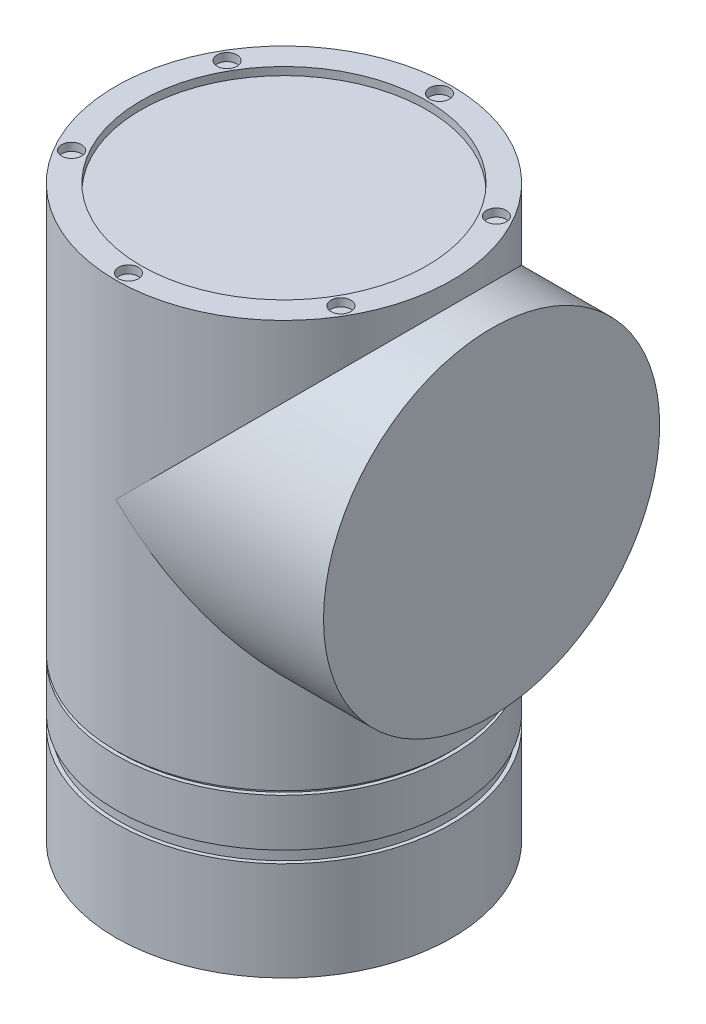
ISO-10303-21;
HEADER;
FILE_DESCRIPTION(('STEP AP214'),'2;1');
FILE_NAME('part.step','',(''),(''),'','','');
FILE_SCHEMA(('AUTOMOTIVE_DESIGN { 1 0 10303 214 1 1 1 1 }'));
ENDSEC;
DATA;
#1=APPLICATION_CONTEXT('core data for automotive mechanical design processes');
#2=APPLICATION_PROTOCOL_DEFINITION('international standard','automotive_design',2000,#1);
#3=PRODUCT_CONTEXT('',#1,'mechanical');
#4=PRODUCT('Part','Part','',(#3));
#5=PRODUCT_RELATED_PRODUCT_CATEGORY('part','',(#4));
#6=PRODUCT_DEFINITION_FORMATION('','',#4);
#7=PRODUCT_DEFINITION_CONTEXT('part definition',#1,'design');
#8=PRODUCT_DEFINITION('design','',#6,#7);
#9=PRODUCT_DEFINITION_SHAPE('','',#8);
#10=(LENGTH_UNIT() NAMED_UNIT(*) SI_UNIT(.MILLI.,.METRE.));
#11=(NAMED_UNIT(*) PLANE_ANGLE_UNIT() SI_UNIT($,.RADIAN.));
#12=(NAMED_UNIT(*) SI_UNIT($,.STERADIAN.) SOLID_ANGLE_UNIT());
#13=UNCERTAINTY_MEASURE_WITH_UNIT(LENGTH_MEASURE(1.E-05),#10,'distance_accuracy_value','');
#14=(GEOMETRIC_REPRESENTATION_CONTEXT(3) GLOBAL_UNCERTAINTY_ASSIGNED_CONTEXT((#13)) GLOBAL_UNIT_ASSIGNED_CONTEXT((#10,
#11,#12)) REPRESENTATION_CONTEXT('',''));
#15=CARTESIAN_POINT('',(0.,0.,0.));
#16=DIRECTION('',(0.,0.,1.));
#17=DIRECTION('',(1.,0.,0.));
#18=AXIS2_PLACEMENT_3D('',#15,#16,#17);
#19=CARTESIAN_POINT('',(0.,142.,0.));
#20=DIRECTION('',(0.,-1.,0.));
#21=DIRECTION('',(0.,0.,-1.));
#22=AXIS2_PLACEMENT_3D('',#19,#20,#21);
#23=CYLINDRICAL_SURFACE('',#22,42.5);
#24=CARTESIAN_POINT('',(0.,40.,0.));
#25=DIRECTION('',(0.,-1.,0.));
#26=DIRECTION('',(0.,0.,-1.));
#27=AXIS2_PLACEMENT_3D('',#24,#25,#26);
#28=CIRCLE('',#27,42.5);
#29=CARTESIAN_POINT('',(0.,40.,-42.5));
#30=VERTEX_POINT('',#29);
#31=EDGE_CURVE('E234',#30,#30,#28,.T.);
#32=ORIENTED_EDGE('',*,*,#31,.T.);
#33=EDGE_LOOP('',(#32));
#34=FACE_BOUND('',#33,.T.);
#35=CARTESIAN_POINT('',(0.,28.,0.));
#36=DIRECTION('',(0.,-1.,0.));
#37=DIRECTION('',(0.,0.,-1.));
#38=AXIS2_PLACEMENT_3D('',#35,#36,#37);
#39=CIRCLE('',#38,42.5);
#40=CARTESIAN_POINT('',(0.,28.,-42.5));
#41=VERTEX_POINT('',#40);
#42=EDGE_CURVE('E253',#41,#41,#39,.T.);
#43=ORIENTED_EDGE('',*,*,#42,.F.);
#44=EDGE_LOOP('',(#43));
#45=FACE_BOUND('',#44,.T.);
#46=ADVANCED_FACE('F51',(#34,#45),#23,.T.);
#47=CARTESIAN_POINT('',(0.,28.,0.));
#48=DIRECTION('',(0.,-1.,0.));
#49=DIRECTION('',(0.,0.,-1.));
#50=AXIS2_PLACEMENT_3D('',#47,#48,#49);
#51=PLANE('',#50);
#52=CARTESIAN_POINT('',(0.,28.,0.));
#53=DIRECTION('',(0.,-1.,0.));
#54=DIRECTION('',(0.,0.,-1.));
#55=AXIS2_PLACEMENT_3D('',#52,#53,#54);
#56=CIRCLE('',#55,41.5461057336744);
#57=CARTESIAN_POINT('',(0.,28.,-41.5461057336744));
#58=VERTEX_POINT('',#57);
#59=EDGE_CURVE('E245',#58,#58,#56,.T.);
#60=ORIENTED_EDGE('',*,*,#59,.F.);
#61=EDGE_LOOP('',(#60));
#62=FACE_BOUND('',#61,.T.);
#63=ORIENTED_EDGE('',*,*,#42,.T.);
#64=EDGE_LOOP('',(#63));
#65=FACE_BOUND('',#64,.T.);
#66=ADVANCED_FACE('F135',(#62,#65),#51,.T.);
#67=CARTESIAN_POINT('',(0.,25.,0.));
#68=DIRECTION('',(0.,-1.,0.));
#69=DIRECTION('',(0.,0.,-1.));
#70=AXIS2_PLACEMENT_3D('',#67,#68,#69);
#71=PLANE('',#70);
#72=CARTESIAN_POINT('',(0.,25.,0.));
#73=DIRECTION('',(0.,-1.,0.));
#74=DIRECTION('',(0.,0.,-1.));
#75=AXIS2_PLACEMENT_3D('',#72,#73,#74);
#76=CIRCLE('',#75,41.5461057336744);
#77=CARTESIAN_POINT('',(0.,25.,-41.5461057336744));
#78=VERTEX_POINT('',#77);
#79=EDGE_CURVE('E242',#78,#78,#76,.T.);
#80=ORIENTED_EDGE('',*,*,#79,.T.);
#81=EDGE_LOOP('',(#80));
#82=FACE_BOUND('',#81,.T.);
#83=CARTESIAN_POINT('',(0.,25.,0.));
#84=DIRECTION('',(0.,-1.,0.));
#85=DIRECTION('',(0.,0.,-1.));
#86=AXIS2_PLACEMENT_3D('',#83,#84,#85);
#87=CIRCLE('',#86,42.5);
#88=CARTESIAN_POINT('',(0.,25.,-42.5));
#89=VERTEX_POINT('',#88);
#90=EDGE_CURVE('E249',#89,#89,#87,.T.);
#91=ORIENTED_EDGE('',*,*,#90,.F.);
#92=EDGE_LOOP('',(#91));
#93=FACE_BOUND('',#92,.T.);
#94=ADVANCED_FACE('F142',(#82,#93),#71,.F.);
#95=CARTESIAN_POINT('',(0.,28.,0.));
#96=DIRECTION('',(0.,-1.,0.));
#97=DIRECTION('',(0.,0.,-1.));
#98=AXIS2_PLACEMENT_3D('',#95,#96,#97);
#99=CYLINDRICAL_SURFACE('',#98,41.5461057336744);
#100=ORIENTED_EDGE('',*,*,#59,.T.);
#101=EDGE_LOOP('',(#100));
#102=FACE_BOUND('',#101,.T.);
#103=ORIENTED_EDGE('',*,*,#79,.F.);
#104=EDGE_LOOP('',(#103));
#105=FACE_BOUND('',#104,.T.);
#106=ADVANCED_FACE('F202',(#102,#105),#99,.T.);
#107=CARTESIAN_POINT('',(0.,0.,0.));
#108=DIRECTION('',(0.,1.,0.));
#109=DIRECTION('',(0.,0.,1.));
#110=AXIS2_PLACEMENT_3D('',#107,#108,#109);
#111=PLANE('',#110);
#112=CARTESIAN_POINT('',(0.,0.,0.));
#113=DIRECTION('',(0.,1.,0.));
#114=DIRECTION('',(0.,0.,1.));
#115=AXIS2_PLACEMENT_3D('',#112,#113,#114);
#116=CIRCLE('',#115,42.5);
#117=CARTESIAN_POINT('',(0.,0.,42.5));
#118=VERTEX_POINT('',#117);
#119=EDGE_CURVE('E83',#118,#118,#116,.T.);
#120=ORIENTED_EDGE('',*,*,#119,.F.);
#121=EDGE_LOOP('',(#120));
#122=FACE_BOUND('',#121,.T.);
#123=ADVANCED_FACE('F149',(#122),#111,.F.);
#124=CARTESIAN_POINT('',(0.,19.7233418888855,-42.5));
#125=CARTESIAN_POINT('',(-0.205001015890256,19.7233452036694,-42.5000014891887));
#126=CARTESIAN_POINT('',(-0.409957786885752,19.7147687216055,-42.4985140322993));
#127=CARTESIAN_POINT('',(-0.818460135697382,19.6805345097757,-42.4926089711838));
#128=CARTESIAN_POINT('',(-1.02200543378601,19.6548734867107,-42.48819080202));
#129=CARTESIAN_POINT('',(-1.42628084383077,19.5866416802387,-42.4765424370106));
#130=CARTESIAN_POINT('',(-1.62700915951593,19.5440605734214,-42.4693105244788));
#131=CARTESIAN_POINT('',(-2.02417832947773,19.4422983747727,-42.452234621174));
#132=CARTESIAN_POINT('',(-2.22061758151466,19.3831111901104,-42.4423896717399));
#133=CARTESIAN_POINT('',(-2.60751307364393,19.2486727209297,-42.420376924802));
#134=CARTESIAN_POINT('',(-2.79797634224612,19.1734411863751,-42.4082119850448));
#135=CARTESIAN_POINT('',(-3.17192422004898,19.0073954740193,-42.3818834700556));
#136=CARTESIAN_POINT('',(-3.35540622659961,18.9165755529961,-42.3677191585389));
#137=CARTESIAN_POINT('',(-3.71397708659283,18.7200752210813,-42.3377931743663));
#138=CARTESIAN_POINT('',(-3.88906998516464,18.6144020709351,-42.3220322832161));
#139=CARTESIAN_POINT('',(-4.22984042654034,18.3888644704072,-42.2893339375006));
#140=CARTESIAN_POINT('',(-4.3955144319812,18.2689947397838,-42.2723960461388));
#141=CARTESIAN_POINT('',(-4.71768405981388,18.0148039999747,-42.2376602511322));
#142=CARTESIAN_POINT('',(-4.87408567191039,17.8803646834537,-42.2198560719953));
#143=CARTESIAN_POINT('',(-5.1750940518456,17.5987946304154,-42.1840181689984));
#144=CARTESIAN_POINT('',(-5.31969643075546,17.4516592128565,-42.1659843625821));
#145=CARTESIAN_POINT('',(-5.59600985649073,17.1457927220761,-42.1302039045343));
#146=CARTESIAN_POINT('',(-5.72772477441687,16.9870651560465,-42.1124571680187));
#147=CARTESIAN_POINT('',(-5.97744615461754,16.6589963705225,-42.0777380659357));
#148=CARTESIAN_POINT('',(-6.09544754312114,16.489651258167,-42.0607659883802));
#149=CARTESIAN_POINT('',(-6.31757404567211,16.1404237407953,-42.0279781789768));
#150=CARTESIAN_POINT('',(-6.42160395221873,15.960479984059,-42.0121706827836));
#151=CARTESIAN_POINT('',(-6.61411757609686,15.5923188018108,-41.9822932076725));
#152=CARTESIAN_POINT('',(-6.70260117632414,15.4041013139894,-41.9682232418429));
#153=CARTESIAN_POINT('',(-6.86335417296575,15.0207351393999,-41.9422341261645));
#154=CARTESIAN_POINT('',(-6.9356246922807,14.8255869337309,-41.9303148273739));
#155=CARTESIAN_POINT('',(-7.06340662132321,14.4297406361941,-41.9089785992927));
#156=CARTESIAN_POINT('',(-7.11891782540366,14.2290424762579,-41.8995617007081));
#157=CARTESIAN_POINT('',(-7.21227113945032,13.8256018114382,-41.8835930680926));
#158=CARTESIAN_POINT('',(-7.25028583665132,13.6229003510677,-41.8770133901273));
#159=CARTESIAN_POINT('',(-7.30918016527985,13.2148808983572,-41.8667741391132));
#160=CARTESIAN_POINT('',(-7.33005387667162,13.0095620268755,-41.8631155749506));
#161=CARTESIAN_POINT('',(-7.35446769668504,12.5979387968941,-41.8588339134962));
#162=CARTESIAN_POINT('',(-7.35801524630743,12.3916348995408,-41.8582095131343));
#163=CARTESIAN_POINT('',(-7.34778880285966,11.9794494684907,-41.8600043189046));
#164=CARTESIAN_POINT('',(-7.33400844075111,11.7735681179709,-41.8624246441547));
#165=CARTESIAN_POINT('',(-7.26725853926576,11.1635490476873,-41.8740904953952));
#166=CARTESIAN_POINT('',(-7.18917282933193,10.7619376511185,-41.8876909121923));
#167=CARTESIAN_POINT('',(-6.96785537713704,9.97782812932633,-41.9250679770689));
#168=CARTESIAN_POINT('',(-6.82462124174804,9.59533070679848,-41.9488449989686));
#169=CARTESIAN_POINT('',(-6.4763038609411,8.85774356233763,-42.0040310149472));
#170=CARTESIAN_POINT('',(-6.27090531796325,8.50280543270251,-42.0354787532358));
#171=CARTESIAN_POINT('',(-5.80431348470058,7.83215931720188,-42.1024383290227));
#172=CARTESIAN_POINT('',(-5.54311534767137,7.51645474292733,-42.1379505194343));
#173=CARTESIAN_POINT('',(-4.96818047358624,6.92878773797463,-42.2096201026689));
#174=CARTESIAN_POINT('',(-4.65378749423016,6.65746713801879,-42.2457797705059));
#175=CARTESIAN_POINT('',(-3.9835998805538,6.17133220973879,-42.3142316970499));
#176=CARTESIAN_POINT('',(-3.62780493932811,5.95651830032718,-42.3465239270846));
#177=CARTESIAN_POINT('',(-2.88429014131261,5.58942398833312,-42.4036537568766));
#178=CARTESIAN_POINT('',(-2.49654024500875,5.43720325080488,-42.4284842379068));
#179=CARTESIAN_POINT('',(-1.70045166798649,5.20022810059353,-42.4678364063803));
#180=CARTESIAN_POINT('',(-1.29211484970346,5.11546759659521,-42.4823590245583));
#181=CARTESIAN_POINT('',(-0.471973322144671,5.01669553253738,-42.4993332417928));
#182=CARTESIAN_POINT('',(-0.0602776760047884,5.0018033017894,-42.5019350890783));
#183=CARTESIAN_POINT('',(0.759725008440708,5.04083959687161,-42.4951870588527));
#184=CARTESIAN_POINT('',(1.1680321869936,5.09476525991424,-42.4858376785064));
#185=CARTESIAN_POINT('',(1.96692273581636,5.26916964493616,-42.4563312537302));
#186=CARTESIAN_POINT('',(2.35760478770035,5.38920954329473,-42.4362454960913));
#187=CARTESIAN_POINT('',(3.11330742763575,5.69198162772712,-42.3875077784328));
#188=CARTESIAN_POINT('',(3.47832648094009,5.87471755943124,-42.3588553066277));
#189=CARTESIAN_POINT('',(4.17610532528817,6.29962936701599,-42.2957942298708));
#190=CARTESIAN_POINT('',(4.5085271557143,6.54235136561246,-42.2613337198331));
#191=CARTESIAN_POINT('',(5.12835485058606,7.07983112989924,-42.1906082665937));
#192=CARTESIAN_POINT('',(5.41575716913043,7.37459299055383,-42.1543431815533));
#193=CARTESIAN_POINT('',(5.80841292862035,7.85108531769192,-42.1014267051054));
#194=CARTESIAN_POINT('',(5.93352679349028,8.01674773111094,-42.0839336835874));
#195=CARTESIAN_POINT('',(6.16934719927179,8.35810575489905,-42.050009770495));
#196=CARTESIAN_POINT('',(6.28005903842429,8.53379764118958,-42.0335784894518));
#197=CARTESIAN_POINT('',(6.48631186329523,8.89406791911638,-42.0022458605319));
#198=CARTESIAN_POINT('',(6.58184761551047,9.07864934785602,-41.9873450410612));
#199=CARTESIAN_POINT('',(6.75697901069841,9.45529285937507,-41.9595173436591));
#200=CARTESIAN_POINT('',(6.83658041968496,9.64735220602875,-41.9465897520976));
#201=CARTESIAN_POINT('',(6.9789803057627,10.0368272052853,-41.9231323285764));
#202=CARTESIAN_POINT('',(7.04184791736722,10.2342169880034,-41.9125926588408));
#203=CARTESIAN_POINT('',(7.15073527967042,10.6337077798107,-41.8941527868374));
#204=CARTESIAN_POINT('',(7.196755429373,10.8358086772043,-41.88625252206));
#205=CARTESIAN_POINT('',(7.27158667500757,11.2432504975175,-41.8733264928221));
#206=CARTESIAN_POINT('',(7.30039881662388,11.4485912227828,-41.8683005536974));
#207=CARTESIAN_POINT('',(7.34058880205778,11.8610193807757,-41.8612729646456));
#208=CARTESIAN_POINT('',(7.35196709117927,12.0681067687533,-41.8592712374727));
#209=CARTESIAN_POINT('',(7.35716500758482,12.4797488806546,-41.8583579271457));
#210=CARTESIAN_POINT('',(7.35121633615848,12.6843006256027,-41.8594055668159));
#211=CARTESIAN_POINT('',(7.32231060457494,13.092089166288,-41.8644715957071));
#212=CARTESIAN_POINT('',(7.29935956608962,13.2953264018808,-41.8684889331591));
#213=CARTESIAN_POINT('',(7.23662857611352,13.699144607556,-41.8793770022123));
#214=CARTESIAN_POINT('',(7.19684567922646,13.8997251063993,-41.8862482332108));
#215=CARTESIAN_POINT('',(7.10075653934576,14.2967721249961,-41.9026446512366));
#216=CARTESIAN_POINT('',(7.04445061870373,14.4932387249284,-41.9121697864882));
#217=CARTESIAN_POINT('',(6.91582635616162,14.8804274717334,-41.9335854239242));
#218=CARTESIAN_POINT('',(6.84352980348722,15.0711570380807,-41.9454727051728));
#219=CARTESIAN_POINT('',(6.68341211075561,15.4458386064086,-41.9712827281575));
#220=CARTESIAN_POINT('',(6.59559104363021,15.6297906402241,-41.9852054603312));
#221=CARTESIAN_POINT('',(6.40503272980558,15.9897120210115,-42.0146980022025));
#222=CARTESIAN_POINT('',(6.30229218977161,16.1656795942028,-42.0302681753508));
#223=CARTESIAN_POINT('',(6.08266851316491,16.5083492496053,-42.0626134995855));
#224=CARTESIAN_POINT('',(5.96579032681454,16.6750545452891,-42.0793882280719));
#225=CARTESIAN_POINT('',(5.71703629578429,17.0002861623162,-42.1139105827601));
#226=CARTESIAN_POINT('',(5.5849833583144,17.1586760140549,-42.1316681056043));
#227=CARTESIAN_POINT('',(5.3081166290217,17.4637423400851,-42.1674444204178));
#228=CARTESIAN_POINT('',(5.16330739799467,17.6104229653445,-42.1854631170992));
#229=CARTESIAN_POINT('',(4.86178754451479,17.8912155222056,-42.2212751885599));
#230=CARTESIAN_POINT('',(4.70506988610543,18.0253199171017,-42.2390684227695));
#231=CARTESIAN_POINT('',(4.38093753335815,18.2798858963922,-42.2739156044346));
#232=CARTESIAN_POINT('',(4.21352680719519,18.4003524962602,-42.2909698222391));
#233=CARTESIAN_POINT('',(3.86773470021291,18.6277493107967,-42.3240005683133));
#234=CARTESIAN_POINT('',(3.68927708083535,18.7345650354099,-42.3399675154897));
#235=CARTESIAN_POINT('',(3.32391622186438,18.9327191858653,-42.3702155778416));
#236=CARTESIAN_POINT('',(3.13701612271107,19.0240633077611,-42.3844973128579));
#237=CARTESIAN_POINT('',(2.75614868854581,19.1905856366128,-42.4109660609636));
#238=CARTESIAN_POINT('',(2.56218625346513,19.2657748112174,-42.4231544940676));
#239=CARTESIAN_POINT('',(2.16853035978464,19.3994749686408,-42.445098229273));
#240=CARTESIAN_POINT('',(1.96883811848455,19.4579894655449,-42.4548540439793));
#241=CARTESIAN_POINT('',(1.47844859117377,19.5793413287485,-42.4752561707186));
#242=CARTESIAN_POINT('',(1.18544137204573,19.6332757542014,-42.4844909296805));
#243=CARTESIAN_POINT('',(0.594925000899057,19.7052732810148,-42.4968617047758));
#244=CARTESIAN_POINT('',(0.297415936520804,19.7233370797894,-42.4999978394817));
#245=CARTESIAN_POINT('',(0.,19.7233418888855,-42.5));
#246=B_SPLINE_CURVE_WITH_KNOTS('',3,(#124,#125,#126,#127,#128,#129,#130,#131,#132,#133,#134,
#135,#136,#137,#138,#139,#140,#141,#142,#143,#144,#145,#146,#147,#148,#149,#150,#151,#152,#153,
#154,#155,#156,#157,#158,#159,#160,#161,#162,#163,#164,#165,#166,#167,#168,#169,#170,#171,#172,
#173,#174,#175,#176,#177,#178,#179,#180,#181,#182,#183,#184,#185,#186,#187,#188,#189,#190,#191,
#192,#193,#194,#195,#196,#197,#198,#199,#200,#201,#202,#203,#204,#205,#206,#207,#208,#209,#210,
#211,#212,#213,#214,#215,#216,#217,#218,#219,#220,#221,#222,#223,#224,#225,#226,#227,#228,#229,
#230,#231,#232,#233,#234,#235,#236,#237,#238,#239,#240,#241,#242,#243,#244,#245),.UNSPECIFIED.,
.T.,.F.,(4,2,2,2,2,2,2,2,2,2,2,2,2,2,2,2,2,2,2,2,2,2,2,2,2,2,2,2,2,2,2,2,2,2,2,2,2,2,2,2,2,2,2,
2,2,2,2,2,2,2,2,2,2,2,2,2,2,2,2,2,4),(0.,0.614742274478696,1.22960308398978,1.84483961449658,
2.46030217340683,3.07501145046297,3.68994769262084,4.30458437250048,4.91945038106621,
5.53974808210535,6.16027547166984,6.78061589295844,7.40118510376965,8.02578906781997,
8.65039773656568,9.2749631322197,9.89953619136423,10.5178089098576,11.1362950734266,
11.7545155947262,12.3729634152812,13.5947334330388,14.8165483342776,16.0446671901562,
17.2728927636592,18.5175529841873,19.7622224317486,21.0080755878626,22.2538162370209,
23.4838117014666,24.7137560004269,25.9356334202409,27.1575838510254,28.3910977346956,
29.624708725627,30.2491024613124,30.8732658404618,31.4976439984763,32.1217958084622,
32.743327481872,33.364844434393,33.9863236151583,34.6077869215372,35.2209781467226,
35.8339523037716,36.4470337691748,37.060103274621,37.6723424874722,38.2845788241928,
38.8969505124006,39.5091083992147,40.1293204982074,40.7493117440002,41.3696721961751,
41.9898037565782,42.6148357335925,43.2396370951373,43.864012927131,44.488257078302,
45.3801438981949,46.2720133774218),.UNSPECIFIED.);
#247=CARTESIAN_POINT('',(0.,19.7233418888855,-42.5));
#248=VERTEX_POINT('',#247);
#249=EDGE_CURVE('E56',#248,#248,#246,.T.);
#250=ORIENTED_EDGE('',*,*,#249,.T.);
#251=EDGE_LOOP('',(#250));
#252=FACE_BOUND('',#251,.T.);
#253=ORIENTED_EDGE('',*,*,#90,.T.);
#254=EDGE_LOOP('',(#253));
#255=FACE_BOUND('',#254,.T.);
#256=ORIENTED_EDGE('',*,*,#119,.T.);
#257=EDGE_LOOP('',(#256));
#258=FACE_BOUND('',#257,.T.);
#259=ADVANCED_FACE('F53',(#252,#255,#258),#23,.T.);
#260=CARTESIAN_POINT('',(0.,41.,0.));
#261=DIRECTION('',(0.,-1.,0.));
#262=DIRECTION('',(0.,0.,-1.));
#263=AXIS2_PLACEMENT_3D('',#260,#261,#262);
#264=PLANE('',#263);
#265=CARTESIAN_POINT('',(0.,41.,0.));
#266=DIRECTION('',(0.,-1.,0.));
#267=DIRECTION('',(0.,0.,-1.));
#268=AXIS2_PLACEMENT_3D('',#265,#266,#267);
#269=CIRCLE('',#268,41.5461057336744);
#270=CARTESIAN_POINT('',(0.,41.,-41.5461057336744));
#271=VERTEX_POINT('',#270);
#272=EDGE_CURVE('E230',#271,#271,#269,.T.);
#273=ORIENTED_EDGE('',*,*,#272,.F.);
#274=EDGE_LOOP('',(#273));
#275=FACE_BOUND('',#274,.T.);
#276=CARTESIAN_POINT('',(0.,41.,0.));
#277=DIRECTION('',(0.,-1.,0.));
#278=DIRECTION('',(0.,0.,-1.));
#279=AXIS2_PLACEMENT_3D('',#276,#277,#278);
#280=CIRCLE('',#279,42.5);
#281=CARTESIAN_POINT('',(0.,41.,-42.5));
#282=VERTEX_POINT('',#281);
#283=EDGE_CURVE('E238',#282,#282,#280,.T.);
#284=ORIENTED_EDGE('',*,*,#283,.T.);
#285=EDGE_LOOP('',(#284));
#286=FACE_BOUND('',#285,.T.);
#287=ADVANCED_FACE('F148',(#275,#286),#264,.T.);
#288=CARTESIAN_POINT('',(0.,40.,0.));
#289=DIRECTION('',(0.,-1.,0.));
#290=DIRECTION('',(0.,0.,-1.));
#291=AXIS2_PLACEMENT_3D('',#288,#289,#290);
#292=PLANE('',#291);
#293=CARTESIAN_POINT('',(0.,40.,0.));
#294=DIRECTION('',(0.,-1.,0.));
#295=DIRECTION('',(0.,0.,-1.));
#296=AXIS2_PLACEMENT_3D('',#293,#294,#295);
#297=CIRCLE('',#296,41.5461057336744);
#298=CARTESIAN_POINT('',(0.,40.,-41.5461057336744));
#299=VERTEX_POINT('',#298);
#300=EDGE_CURVE('E228',#299,#299,#297,.T.);
#301=ORIENTED_EDGE('',*,*,#300,.T.);
#302=EDGE_LOOP('',(#301));
#303=FACE_BOUND('',#302,.T.);
#304=ORIENTED_EDGE('',*,*,#31,.F.);
#305=EDGE_LOOP('',(#304));
#306=FACE_BOUND('',#305,.T.);
#307=ADVANCED_FACE('F207',(#303,#306),#292,.F.);
#308=CARTESIAN_POINT('',(0.,41.,0.));
#309=DIRECTION('',(0.,-1.,0.));
#310=DIRECTION('',(0.,0.,-1.));
#311=AXIS2_PLACEMENT_3D('',#308,#309,#310);
#312=CYLINDRICAL_SURFACE('',#311,41.5461057336744);
#313=ORIENTED_EDGE('',*,*,#272,.T.);
#314=EDGE_LOOP('',(#313));
#315=FACE_BOUND('',#314,.T.);
#316=ORIENTED_EDGE('',*,*,#300,.F.);
#317=EDGE_LOOP('',(#316));
#318=FACE_BOUND('',#317,.T.);
#319=ADVANCED_FACE('F210',(#315,#318),#312,.T.);
#320=CARTESIAN_POINT('',(0.,142.,0.));
#321=DIRECTION('',(0.,1.,0.));
#322=DIRECTION('',(0.,0.,1.));
#323=AXIS2_PLACEMENT_3D('',#320,#321,#322);
#324=PLANE('',#323);
#325=CARTESIAN_POINT('',(-34.0513042690051,142.,-19.6595296859685));
#326=DIRECTION('',(0.,1.,0.));
#327=DIRECTION('',(0.,0.,1.));
#328=AXIS2_PLACEMENT_3D('',#325,#326,#327);
#329=CIRCLE('',#328,2.50817893346181);
#330=CARTESIAN_POINT('',(-34.0513042690051,142.,-17.1513507525067));
#331=VERTEX_POINT('',#330);
#332=EDGE_CURVE('E79',#331,#331,#329,.F.);
#333=ORIENTED_EDGE('',*,*,#332,.F.);
#334=EDGE_LOOP('',(#333));
#335=FACE_BOUND('',#334,.T.);
#336=ADVANCED_FACE('F131',(#335),#324,.T.);
#337=CARTESIAN_POINT('',(2.05648523929315E-12,142.,39.3190593719376));
#338=DIRECTION('',(0.,1.,0.));
#339=DIRECTION('',(0.,0.,1.));
#340=AXIS2_PLACEMENT_3D('',#337,#338,#339);
#341=CIRCLE('',#340,2.50817893346361);
#342=CARTESIAN_POINT('',(2.05648523929315E-12,142.,41.8272383054012));
#343=VERTEX_POINT('',#342);
#344=EDGE_CURVE('E98',#343,#343,#341,.F.);
#345=ORIENTED_EDGE('',*,*,#344,.F.);
#346=EDGE_LOOP('',(#345));
#347=FACE_BOUND('',#346,.T.);
#348=ADVANCED_FACE('F129',(#347),#324,.T.);
#349=CARTESIAN_POINT('',(34.0513042690081,142.,-19.6595296859692));
#350=DIRECTION('',(0.,1.,0.));
#351=DIRECTION('',(0.,0.,1.));
#352=AXIS2_PLACEMENT_3D('',#349,#350,#351);
#353=CIRCLE('',#352,2.50817893346063);
#354=CARTESIAN_POINT('',(34.0513042690081,142.,-17.1513507525085));
#355=VERTEX_POINT('',#354);
#356=EDGE_CURVE('E106',#355,#355,#353,.F.);
#357=ORIENTED_EDGE('',*,*,#356,.F.);
#358=EDGE_LOOP('',(#357));
#359=FACE_BOUND('',#358,.T.);
#360=ADVANCED_FACE('F121',(#359),#324,.T.);
#361=CARTESIAN_POINT('',(0.,142.,0.));
#362=DIRECTION('',(0.,1.,0.));
#363=DIRECTION('',(0.,0.,1.));
#364=AXIS2_PLACEMENT_3D('',#361,#362,#363);
#365=CIRCLE('',#364,36.1435952460319);
#366=CARTESIAN_POINT('',(0.,142.,36.1435952460319));
#367=VERTEX_POINT('',#366);
#368=EDGE_CURVE('E11',#367,#367,#365,.F.);
#369=ORIENTED_EDGE('',*,*,#368,.F.);
#370=EDGE_LOOP('',(#369));
#371=FACE_BOUND('',#370,.T.);
#372=ADVANCED_FACE('F119',(#371),#324,.T.);
#373=CARTESIAN_POINT('',(1.28161381428317E-12,142.,-39.3190593719376));
#374=DIRECTION('',(0.,1.,0.));
#375=DIRECTION('',(0.,0.,1.));
#376=AXIS2_PLACEMENT_3D('',#373,#374,#375);
#377=CIRCLE('',#376,2.50817893346016);
#378=CARTESIAN_POINT('',(1.28161381428317E-12,142.,-36.8108804384775));
#379=VERTEX_POINT('',#378);
#380=EDGE_CURVE('E66',#379,#379,#377,.F.);
#381=ORIENTED_EDGE('',*,*,#380,.F.);
#382=EDGE_LOOP('',(#381));
#383=FACE_BOUND('',#382,.T.);
#384=ADVANCED_FACE('F116',(#383),#324,.T.);
#385=CARTESIAN_POINT('',(34.0513042690085,142.,19.6595296859685));
#386=DIRECTION('',(0.,1.,0.));
#387=DIRECTION('',(0.,0.,1.));
#388=AXIS2_PLACEMENT_3D('',#385,#386,#387);
#389=CIRCLE('',#388,2.50817893346231);
#390=CARTESIAN_POINT('',(34.0513042690085,142.,22.1677086194308));
#391=VERTEX_POINT('',#390);
#392=EDGE_CURVE('E102',#391,#391,#389,.F.);
#393=ORIENTED_EDGE('',*,*,#392,.F.);
#394=EDGE_LOOP('',(#393));
#395=FACE_BOUND('',#394,.T.);
#396=ADVANCED_FACE('F118',(#395),#324,.T.);
#397=CARTESIAN_POINT('',(-34.0513042690047,142.,19.6595296859692));
#398=DIRECTION('',(0.,1.,0.));
#399=DIRECTION('',(0.,0.,1.));
#400=AXIS2_PLACEMENT_3D('',#397,#398,#399);
#401=CIRCLE('',#400,2.50817893346333);
#402=CARTESIAN_POINT('',(-34.0513042690047,142.,22.1677086194325));
#403=VERTEX_POINT('',#402);
#404=EDGE_CURVE('E94',#403,#403,#401,.F.);
#405=ORIENTED_EDGE('',*,*,#404,.F.);
#406=EDGE_LOOP('',(#405));
#407=FACE_BOUND('',#406,.T.);
#408=ADVANCED_FACE('F127',(#407),#324,.T.);
#409=CARTESIAN_POINT('',(-34.0513042690051,144.,-19.6595296859685));
#410=DIRECTION('',(0.,-1.,0.));
#411=DIRECTION('',(0.,0.,-1.));
#412=AXIS2_PLACEMENT_3D('',#409,#410,#411);
#413=CYLINDRICAL_SURFACE('',#412,2.50817893346181);
#414=CARTESIAN_POINT('',(-34.0513042690051,144.,-19.6595296859685));
#415=DIRECTION('',(0.,1.,0.));
#416=DIRECTION('',(0.,0.,1.));
#417=AXIS2_PLACEMENT_3D('',#414,#415,#416);
#418=CIRCLE('',#417,2.50817893346181);
#419=CARTESIAN_POINT('',(-34.0513042690051,144.,-17.1513507525067));
#420=VERTEX_POINT('',#419);
#421=EDGE_CURVE('E257',#420,#420,#418,.T.);
#422=ORIENTED_EDGE('',*,*,#421,.T.);
#423=EDGE_LOOP('',(#422));
#424=FACE_BOUND('',#423,.T.);
#425=ORIENTED_EDGE('',*,*,#332,.T.);
#426=EDGE_LOOP('',(#425));
#427=FACE_BOUND('',#426,.T.);
#428=ADVANCED_FACE('F193',(#424,#427),#413,.F.);
#429=CARTESIAN_POINT('',(2.05648523929315E-12,144.,39.3190593719376));
#430=DIRECTION('',(0.,-1.,0.));
#431=DIRECTION('',(0.,0.,-1.));
#432=AXIS2_PLACEMENT_3D('',#429,#430,#431);
#433=CYLINDRICAL_SURFACE('',#432,2.50817893346361);
#434=CARTESIAN_POINT('',(2.05648523929315E-12,144.,39.3190593719376));
#435=DIRECTION('',(0.,1.,0.));
#436=DIRECTION('',(0.,0.,1.));
#437=AXIS2_PLACEMENT_3D('',#434,#435,#436);
#438=CIRCLE('',#437,2.50817893346361);
#439=CARTESIAN_POINT('',(2.05648523929315E-12,144.,41.8272383054012));
#440=VERTEX_POINT('',#439);
#441=EDGE_CURVE('E268',#440,#440,#438,.T.);
#442=ORIENTED_EDGE('',*,*,#441,.T.);
#443=EDGE_LOOP('',(#442));
#444=FACE_BOUND('',#443,.T.);
#445=ORIENTED_EDGE('',*,*,#344,.T.);
#446=EDGE_LOOP('',(#445));
#447=FACE_BOUND('',#446,.T.);
#448=ADVANCED_FACE('F186',(#444,#447),#433,.F.);
#449=CARTESIAN_POINT('',(34.0513042690081,144.,-19.6595296859692));
#450=DIRECTION('',(0.,-1.,0.));
#451=DIRECTION('',(0.,0.,-1.));
#452=AXIS2_PLACEMENT_3D('',#449,#450,#451);
#453=CYLINDRICAL_SURFACE('',#452,2.50817893346063);
#454=CARTESIAN_POINT('',(34.0513042690081,144.,-19.6595296859692));
#455=DIRECTION('',(0.,1.,0.));
#456=DIRECTION('',(0.,0.,1.));
#457=AXIS2_PLACEMENT_3D('',#454,#455,#456);
#458=CIRCLE('',#457,2.50817893346063);
#459=CARTESIAN_POINT('',(34.0513042690081,144.,-17.1513507525085));
#460=VERTEX_POINT('',#459);
#461=EDGE_CURVE('E276',#460,#460,#458,.T.);
#462=ORIENTED_EDGE('',*,*,#461,.T.);
#463=EDGE_LOOP('',(#462));
#464=FACE_BOUND('',#463,.T.);
#465=ORIENTED_EDGE('',*,*,#356,.T.);
#466=EDGE_LOOP('',(#465));
#467=FACE_BOUND('',#466,.T.);
#468=ADVANCED_FACE('F178',(#464,#467),#453,.F.);
#469=CARTESIAN_POINT('',(0.,144.,0.));
#470=DIRECTION('',(0.,-1.,0.));
#471=DIRECTION('',(0.,0.,-1.));
#472=AXIS2_PLACEMENT_3D('',#469,#470,#471);
#473=CYLINDRICAL_SURFACE('',#472,36.1435952460319);
#474=CARTESIAN_POINT('',(0.,144.,0.));
#475=DIRECTION('',(0.,1.,0.));
#476=DIRECTION('',(0.,0.,1.));
#477=AXIS2_PLACEMENT_3D('',#474,#475,#476);
#478=CIRCLE('',#477,36.1435952460319);
#479=CARTESIAN_POINT('',(0.,144.,36.1435952460319));
#480=VERTEX_POINT('',#479);
#481=EDGE_CURVE('E284',#480,#480,#478,.T.);
#482=ORIENTED_EDGE('',*,*,#481,.T.);
#483=EDGE_LOOP('',(#482));
#484=FACE_BOUND('',#483,.T.);
#485=ORIENTED_EDGE('',*,*,#368,.T.);
#486=EDGE_LOOP('',(#485));
#487=FACE_BOUND('',#486,.T.);
#488=ADVANCED_FACE('F175',(#484,#487),#473,.F.);
#489=CARTESIAN_POINT('',(1.28161381428317E-12,144.,-39.3190593719376));
#490=DIRECTION('',(0.,-1.,0.));
#491=DIRECTION('',(0.,0.,-1.));
#492=AXIS2_PLACEMENT_3D('',#489,#490,#491);
#493=CYLINDRICAL_SURFACE('',#492,2.50817893346016);
#494=CARTESIAN_POINT('',(1.28161381428317E-12,144.,-39.3190593719376));
#495=DIRECTION('',(0.,1.,0.));
#496=DIRECTION('',(0.,0.,1.));
#497=AXIS2_PLACEMENT_3D('',#494,#495,#496);
#498=CIRCLE('',#497,2.50817893346016);
#499=CARTESIAN_POINT('',(1.28161381428317E-12,144.,-36.8108804384775));
#500=VERTEX_POINT('',#499);
#501=EDGE_CURVE('E280',#500,#500,#498,.T.);
#502=ORIENTED_EDGE('',*,*,#501,.T.);
#503=EDGE_LOOP('',(#502));
#504=FACE_BOUND('',#503,.T.);
#505=ORIENTED_EDGE('',*,*,#380,.T.);
#506=EDGE_LOOP('',(#505));
#507=FACE_BOUND('',#506,.T.);
#508=ADVANCED_FACE('F114',(#504,#507),#493,.F.);
#509=CARTESIAN_POINT('',(34.0513042690085,144.,19.6595296859685));
#510=DIRECTION('',(0.,-1.,0.));
#511=DIRECTION('',(0.,0.,-1.));
#512=AXIS2_PLACEMENT_3D('',#509,#510,#511);
#513=CYLINDRICAL_SURFACE('',#512,2.50817893346231);
#514=CARTESIAN_POINT('',(34.0513042690085,144.,19.6595296859685));
#515=DIRECTION('',(0.,1.,0.));
#516=DIRECTION('',(0.,0.,1.));
#517=AXIS2_PLACEMENT_3D('',#514,#515,#516);
#518=CIRCLE('',#517,2.50817893346231);
#519=CARTESIAN_POINT('',(34.0513042690085,144.,22.1677086194308));
#520=VERTEX_POINT('',#519);
#521=EDGE_CURVE('E272',#520,#520,#518,.T.);
#522=ORIENTED_EDGE('',*,*,#521,.T.);
#523=EDGE_LOOP('',(#522));
#524=FACE_BOUND('',#523,.T.);
#525=ORIENTED_EDGE('',*,*,#392,.T.);
#526=EDGE_LOOP('',(#525));
#527=FACE_BOUND('',#526,.T.);
#528=ADVANCED_FACE('F182',(#524,#527),#513,.F.);
#529=CARTESIAN_POINT('',(-34.0513042690047,144.,19.6595296859692));
#530=DIRECTION('',(0.,-1.,0.));
#531=DIRECTION('',(0.,0.,-1.));
#532=AXIS2_PLACEMENT_3D('',#529,#530,#531);
#533=CYLINDRICAL_SURFACE('',#532,2.50817893346333);
#534=CARTESIAN_POINT('',(-34.0513042690047,144.,19.6595296859692));
#535=DIRECTION('',(0.,1.,0.));
#536=DIRECTION('',(0.,0.,1.));
#537=AXIS2_PLACEMENT_3D('',#534,#535,#536);
#538=CIRCLE('',#537,2.50817893346333);
#539=CARTESIAN_POINT('',(-34.0513042690047,144.,22.1677086194325));
#540=VERTEX_POINT('',#539);
#541=EDGE_CURVE('E264',#540,#540,#538,.T.);
#542=ORIENTED_EDGE('',*,*,#541,.T.);
#543=EDGE_LOOP('',(#542));
#544=FACE_BOUND('',#543,.T.);
#545=ORIENTED_EDGE('',*,*,#404,.T.);
#546=EDGE_LOOP('',(#545));
#547=FACE_BOUND('',#546,.T.);
#548=ADVANCED_FACE('F172',(#544,#547),#533,.F.);
#549=CARTESIAN_POINT('',(52.5,96.,0.));
#550=DIRECTION('',(1.,0.,0.));
#551=DIRECTION('',(0.,0.,-1.));
#552=AXIS2_PLACEMENT_3D('',#549,#550,#551);
#553=PLANE('',#552);
#554=CARTESIAN_POINT('',(52.5,96.,0.));
#555=DIRECTION('',(1.,0.,0.));
#556=DIRECTION('',(0.,0.,-1.));
#557=AXIS2_PLACEMENT_3D('',#554,#555,#556);
#558=CIRCLE('',#557,42.5);
#559=CARTESIAN_POINT('',(52.5,96.,-42.5));
#560=VERTEX_POINT('',#559);
#561=EDGE_CURVE('E87',#560,#560,#558,.T.);
#562=ORIENTED_EDGE('',*,*,#561,.T.);
#563=EDGE_LOOP('',(#562));
#564=FACE_BOUND('',#563,.T.);
#565=ADVANCED_FACE('F167',(#564),#553,.T.);
#566=CARTESIAN_POINT('',(0.,144.,0.));
#567=DIRECTION('',(0.,1.,0.));
#568=DIRECTION('',(0.,0.,1.));
#569=AXIS2_PLACEMENT_3D('',#566,#567,#568);
#570=PLANE('',#569);
#571=ORIENTED_EDGE('',*,*,#541,.F.);
#572=EDGE_LOOP('',(#571));
#573=FACE_BOUND('',#572,.T.);
#574=ORIENTED_EDGE('',*,*,#521,.F.);
#575=EDGE_LOOP('',(#574));
#576=FACE_BOUND('',#575,.T.);
#577=ORIENTED_EDGE('',*,*,#501,.F.);
#578=EDGE_LOOP('',(#577));
#579=FACE_BOUND('',#578,.T.);
#580=CARTESIAN_POINT('',(0.,144.,0.));
#581=DIRECTION('',(0.,1.,0.));
#582=DIRECTION('',(0.,0.,1.));
#583=AXIS2_PLACEMENT_3D('',#580,#581,#582);
#584=CIRCLE('',#583,42.5);
#585=CARTESIAN_POINT('',(0.,144.,42.5));
#586=VERTEX_POINT('',#585);
#587=EDGE_CURVE('E288',#586,#586,#584,.T.);
#588=ORIENTED_EDGE('',*,*,#587,.T.);
#589=EDGE_LOOP('',(#588));
#590=FACE_BOUND('',#589,.T.);
#591=ORIENTED_EDGE('',*,*,#481,.F.);
#592=EDGE_LOOP('',(#591));
#593=FACE_BOUND('',#592,.T.);
#594=ORIENTED_EDGE('',*,*,#461,.F.);
#595=EDGE_LOOP('',(#594));
#596=FACE_BOUND('',#595,.T.);
#597=ORIENTED_EDGE('',*,*,#441,.F.);
#598=EDGE_LOOP('',(#597));
#599=FACE_BOUND('',#598,.T.);
#600=ORIENTED_EDGE('',*,*,#421,.F.);
#601=EDGE_LOOP('',(#600));
#602=FACE_BOUND('',#601,.T.);
#603=ADVANCED_FACE('F160',(#573,#576,#579,#590,#593,#596,#599,#602),#570,.T.);
#604=CARTESIAN_POINT('',(52.5,96.,0.));
#605=DIRECTION('',(-1.,0.,0.));
#606=DIRECTION('',(0.,0.,1.));
#607=AXIS2_PLACEMENT_3D('',#604,#605,#606);
#608=CYLINDRICAL_SURFACE('',#607,42.5);
#609=ORIENTED_EDGE('',*,*,#561,.F.);
#610=EDGE_LOOP('',(#609));
#611=FACE_BOUND('',#610,.T.);
#612=CARTESIAN_POINT('',(0.,96.,0.));
#613=DIRECTION('',(0.707106781186547,-0.707106781186547,0.));
#614=DIRECTION('',(-0.707106781186547,-0.707106781186547,0.));
#615=AXIS2_PLACEMENT_3D('',#612,#613,#614);
#616=ELLIPSE('',#615,60.1040764008566,42.5);
#617=CARTESIAN_POINT('',(0.,96.,-42.5));
#618=VERTEX_POINT('',#617);
#619=CARTESIAN_POINT('',(0.,96.,42.5));
#620=VERTEX_POINT('',#619);
#621=EDGE_CURVE('E72',#618,#620,#616,.T.);
#622=ORIENTED_EDGE('',*,*,#621,.T.);
#623=CARTESIAN_POINT('',(0.,96.,0.));
#624=DIRECTION('',(-0.707106781186547,-0.707106781186547,0.));
#625=DIRECTION('',(0.707106781186547,-0.707106781186547,0.));
#626=AXIS2_PLACEMENT_3D('',#623,#624,#625);
#627=ELLIPSE('',#626,60.1040764008566,42.5);
#628=EDGE_CURVE('E74',#620,#618,#627,.F.);
#629=ORIENTED_EDGE('',*,*,#628,.T.);
#630=EDGE_LOOP('',(#622,#629));
#631=FACE_BOUND('',#630,.T.);
#632=ADVANCED_FACE('F81',(#611,#631),#608,.T.);
#633=ORIENTED_EDGE('',*,*,#628,.F.);
#634=ORIENTED_EDGE('',*,*,#621,.F.);
#635=EDGE_LOOP('',(#633,#634));
#636=FACE_BOUND('',#635,.T.);
#637=ORIENTED_EDGE('',*,*,#587,.F.);
#638=EDGE_LOOP('',(#637));
#639=FACE_BOUND('',#638,.T.);
#640=ORIENTED_EDGE('',*,*,#283,.F.);
#641=EDGE_LOOP('',(#640));
#642=FACE_BOUND('',#641,.T.);
#643=ADVANCED_FACE('F75',(#636,#639,#642),#23,.T.);
#644=CARTESIAN_POINT('',(0.,12.3681721509356,-51.));
#645=DIRECTION('',(0.,0.,1.));
#646=DIRECTION('',(1.,0.,0.));
#647=AXIS2_PLACEMENT_3D('',#644,#645,#646);
#648=CYLINDRICAL_SURFACE('',#647,7.35516973794986);
#649=CARTESIAN_POINT('',(0.,12.3681721509356,-30.));
#650=DIRECTION('',(0.,0.,1.));
#651=DIRECTION('',(1.,0.,0.));
#652=AXIS2_PLACEMENT_3D('',#649,#650,#651);
#653=CIRCLE('',#652,7.35516973794986);
#654=CARTESIAN_POINT('',(7.35516973794986,12.3681721509356,-30.));
#655=VERTEX_POINT('',#654);
#656=EDGE_CURVE('E223',#655,#655,#653,.T.);
#657=ORIENTED_EDGE('',*,*,#656,.T.);
#658=EDGE_LOOP('',(#657));
#659=FACE_BOUND('',#658,.T.);
#660=ORIENTED_EDGE('',*,*,#249,.F.);
#661=EDGE_LOOP('',(#660));
#662=FACE_BOUND('',#661,.T.);
#663=ADVANCED_FACE('F152',(#659,#662),#648,.F.);
#664=CARTESIAN_POINT('',(0.,12.3681721509356,-30.));
#665=DIRECTION('',(0.,0.,1.));
#666=DIRECTION('',(1.,0.,0.));
#667=AXIS2_PLACEMENT_3D('',#664,#665,#666);
#668=PLANE('',#667);
#669=ORIENTED_EDGE('',*,*,#656,.F.);
#670=EDGE_LOOP('',(#669));
#671=FACE_BOUND('',#670,.T.);
#672=ADVANCED_FACE('F157',(#671),#668,.F.);
#673=CLOSED_SHELL('',(#46,#66,#94,#106,#123,#259,#287,#307,#319,#336,#348,#360,#372,#384,#396,
#408,#428,#448,#468,#488,#508,#528,#548,#565,#603,#632,#643,#663,#672));
#674=MANIFOLD_SOLID_BREP('B2',#673);
#675=ADVANCED_BREP_SHAPE_REPRESENTATION('',(#18,#674),#14);
#676=SHAPE_DEFINITION_REPRESENTATION(#9,#675);
ENDSEC;
END-ISO-10303-21;
